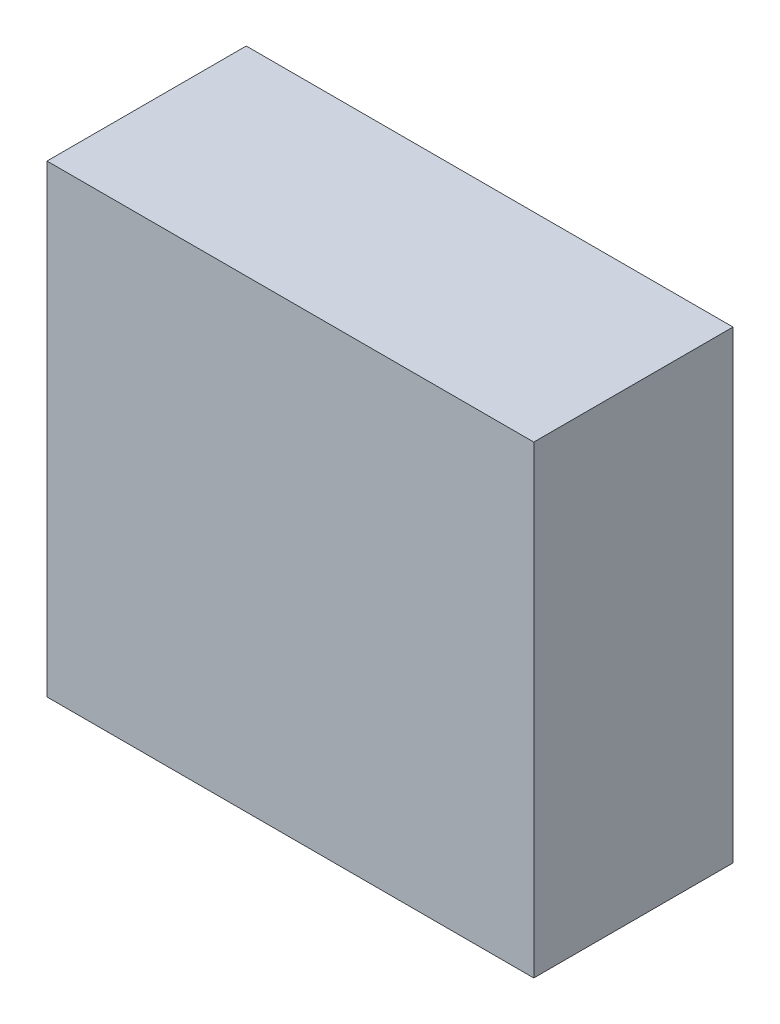
ISO-10303-21;
HEADER;
FILE_DESCRIPTION(('STEP AP214'),'2;1');
FILE_NAME('part.step','',(''),(''),'','','');
FILE_SCHEMA(('AUTOMOTIVE_DESIGN { 1 0 10303 214 1 1 1 1 }'));
ENDSEC;
DATA;
#1=APPLICATION_CONTEXT('core data for automotive mechanical design processes');
#2=APPLICATION_PROTOCOL_DEFINITION('international standard','automotive_design',2000,#1);
#3=PRODUCT_CONTEXT('',#1,'mechanical');
#4=PRODUCT('Part','Part','',(#3));
#5=PRODUCT_RELATED_PRODUCT_CATEGORY('part','',(#4));
#6=PRODUCT_DEFINITION_FORMATION('','',#4);
#7=PRODUCT_DEFINITION_CONTEXT('part definition',#1,'design');
#8=PRODUCT_DEFINITION('design','',#6,#7);
#9=PRODUCT_DEFINITION_SHAPE('','',#8);
#10=(LENGTH_UNIT() NAMED_UNIT(*) SI_UNIT(.MILLI.,.METRE.));
#11=(NAMED_UNIT(*) PLANE_ANGLE_UNIT() SI_UNIT($,.RADIAN.));
#12=(NAMED_UNIT(*) SI_UNIT($,.STERADIAN.) SOLID_ANGLE_UNIT());
#13=UNCERTAINTY_MEASURE_WITH_UNIT(LENGTH_MEASURE(1.E-05),#10,'distance_accuracy_value','');
#14=(GEOMETRIC_REPRESENTATION_CONTEXT(3) GLOBAL_UNCERTAINTY_ASSIGNED_CONTEXT((#13)) GLOBAL_UNIT_ASSIGNED_CONTEXT((#10,
#11,#12)) REPRESENTATION_CONTEXT('',''));
#15=CARTESIAN_POINT('',(0.,0.,0.));
#16=DIRECTION('',(0.,0.,1.));
#17=DIRECTION('',(1.,0.,0.));
#18=AXIS2_PLACEMENT_3D('',#15,#16,#17);
#19=CARTESIAN_POINT('',(21.5,-20.5,17.6));
#20=DIRECTION('',(-1.,0.,0.));
#21=DIRECTION('',(0.,0.,1.));
#22=AXIS2_PLACEMENT_3D('',#19,#20,#21);
#23=PLANE('',#22);
#24=DIRECTION('',(0.,1.,0.));
#25=VECTOR('',#24,1.);
#26=CARTESIAN_POINT('',(21.5,-20.5,0.));
#27=LINE('',#26,#25);
#28=CARTESIAN_POINT('',(21.5,-20.5,0.));
#29=VERTEX_POINT('',#28);
#30=CARTESIAN_POINT('',(21.5,20.5,0.));
#31=VERTEX_POINT('',#30);
#32=EDGE_CURVE('E112',#29,#31,#27,.T.);
#33=ORIENTED_EDGE('',*,*,#32,.T.);
#34=DIRECTION('',(0.,0.,-1.));
#35=VECTOR('',#34,1.);
#36=CARTESIAN_POINT('',(21.5,20.5,17.6));
#37=LINE('',#36,#35);
#38=CARTESIAN_POINT('',(21.5,20.5,17.6));
#39=VERTEX_POINT('',#38);
#40=EDGE_CURVE('E11',#39,#31,#37,.T.);
#41=ORIENTED_EDGE('',*,*,#40,.F.);
#42=DIRECTION('',(0.,1.,0.));
#43=VECTOR('',#42,1.);
#44=CARTESIAN_POINT('',(21.5,-20.5,17.6));
#45=LINE('',#44,#43);
#46=CARTESIAN_POINT('',(21.5,-20.5,17.6));
#47=VERTEX_POINT('',#46);
#48=EDGE_CURVE('E95',#47,#39,#45,.T.);
#49=ORIENTED_EDGE('',*,*,#48,.F.);
#50=DIRECTION('',(0.,0.,-1.));
#51=VECTOR('',#50,1.);
#52=CARTESIAN_POINT('',(21.5,-20.5,17.6));
#53=LINE('',#52,#51);
#54=EDGE_CURVE('E108',#47,#29,#53,.T.);
#55=ORIENTED_EDGE('',*,*,#54,.T.);
#56=EDGE_LOOP('',(#33,#41,#49,#55));
#57=FACE_BOUND('',#56,.T.);
#58=ADVANCED_FACE('F43',(#57),#23,.F.);
#59=CARTESIAN_POINT('',(-21.5,20.5,17.6));
#60=DIRECTION('',(0.,-1.,0.));
#61=DIRECTION('',(0.,0.,-1.));
#62=AXIS2_PLACEMENT_3D('',#59,#60,#61);
#63=PLANE('',#62);
#64=DIRECTION('',(-1.,0.,0.));
#65=VECTOR('',#64,1.);
#66=CARTESIAN_POINT('',(-21.5,20.5,0.));
#67=LINE('',#66,#65);
#68=CARTESIAN_POINT('',(-21.5,20.5,0.));
#69=VERTEX_POINT('',#68);
#70=EDGE_CURVE('E100',#31,#69,#67,.T.);
#71=ORIENTED_EDGE('',*,*,#70,.T.);
#72=DIRECTION('',(0.,0.,-1.));
#73=VECTOR('',#72,1.);
#74=CARTESIAN_POINT('',(-21.5,20.5,17.6));
#75=LINE('',#74,#73);
#76=CARTESIAN_POINT('',(-21.5,20.5,17.6));
#77=VERTEX_POINT('',#76);
#78=EDGE_CURVE('E52',#77,#69,#75,.T.);
#79=ORIENTED_EDGE('',*,*,#78,.F.);
#80=DIRECTION('',(-1.,0.,0.));
#81=VECTOR('',#80,1.);
#82=CARTESIAN_POINT('',(-21.5,20.5,17.6));
#83=LINE('',#82,#81);
#84=EDGE_CURVE('E90',#39,#77,#83,.T.);
#85=ORIENTED_EDGE('',*,*,#84,.F.);
#86=ORIENTED_EDGE('',*,*,#40,.T.);
#87=EDGE_LOOP('',(#71,#79,#85,#86));
#88=FACE_BOUND('',#87,.T.);
#89=ADVANCED_FACE('F99',(#88),#63,.F.);
#90=CARTESIAN_POINT('',(-21.5,-20.5,17.6));
#91=DIRECTION('',(1.,0.,0.));
#92=DIRECTION('',(0.,0.,-1.));
#93=AXIS2_PLACEMENT_3D('',#90,#91,#92);
#94=PLANE('',#93);
#95=DIRECTION('',(0.,-1.,0.));
#96=VECTOR('',#95,1.);
#97=CARTESIAN_POINT('',(-21.5,-20.5,0.));
#98=LINE('',#97,#96);
#99=CARTESIAN_POINT('',(-21.5,-20.5,0.));
#100=VERTEX_POINT('',#99);
#101=EDGE_CURVE('E77',#69,#100,#98,.T.);
#102=ORIENTED_EDGE('',*,*,#101,.T.);
#103=DIRECTION('',(0.,0.,-1.));
#104=VECTOR('',#103,1.);
#105=CARTESIAN_POINT('',(-21.5,-20.5,17.6));
#106=LINE('',#105,#104);
#107=CARTESIAN_POINT('',(-21.5,-20.5,17.6));
#108=VERTEX_POINT('',#107);
#109=EDGE_CURVE('E102',#108,#100,#106,.T.);
#110=ORIENTED_EDGE('',*,*,#109,.F.);
#111=DIRECTION('',(0.,-1.,0.));
#112=VECTOR('',#111,1.);
#113=CARTESIAN_POINT('',(-21.5,-20.5,17.6));
#114=LINE('',#113,#112);
#115=EDGE_CURVE('E93',#77,#108,#114,.T.);
#116=ORIENTED_EDGE('',*,*,#115,.F.);
#117=ORIENTED_EDGE('',*,*,#78,.T.);
#118=EDGE_LOOP('',(#102,#110,#116,#117));
#119=FACE_BOUND('',#118,.T.);
#120=ADVANCED_FACE('F103',(#119),#94,.F.);
#121=CARTESIAN_POINT('',(-21.5,-20.5,17.6));
#122=DIRECTION('',(0.,1.,0.));
#123=DIRECTION('',(0.,0.,1.));
#124=AXIS2_PLACEMENT_3D('',#121,#122,#123);
#125=PLANE('',#124);
#126=DIRECTION('',(1.,0.,0.));
#127=VECTOR('',#126,1.);
#128=CARTESIAN_POINT('',(-21.5,-20.5,0.));
#129=LINE('',#128,#127);
#130=EDGE_CURVE('E83',#100,#29,#129,.T.);
#131=ORIENTED_EDGE('',*,*,#130,.T.);
#132=ORIENTED_EDGE('',*,*,#54,.F.);
#133=DIRECTION('',(1.,0.,0.));
#134=VECTOR('',#133,1.);
#135=CARTESIAN_POINT('',(-21.5,-20.5,17.6));
#136=LINE('',#135,#134);
#137=EDGE_CURVE('E60',#108,#47,#136,.T.);
#138=ORIENTED_EDGE('',*,*,#137,.F.);
#139=ORIENTED_EDGE('',*,*,#109,.T.);
#140=EDGE_LOOP('',(#131,#132,#138,#139));
#141=FACE_BOUND('',#140,.T.);
#142=ADVANCED_FACE('F124',(#141),#125,.F.);
#143=CARTESIAN_POINT('',(0.,0.,17.6));
#144=DIRECTION('',(0.,0.,-1.));
#145=DIRECTION('',(-1.,0.,0.));
#146=AXIS2_PLACEMENT_3D('',#143,#144,#145);
#147=PLANE('',#146);
#148=ORIENTED_EDGE('',*,*,#48,.T.);
#149=ORIENTED_EDGE('',*,*,#84,.T.);
#150=ORIENTED_EDGE('',*,*,#115,.T.);
#151=ORIENTED_EDGE('',*,*,#137,.T.);
#152=EDGE_LOOP('',(#148,#149,#150,#151));
#153=FACE_BOUND('',#152,.T.);
#154=ADVANCED_FACE('F91',(#153),#147,.F.);
#155=CARTESIAN_POINT('',(0.,0.,0.));
#156=DIRECTION('',(0.,0.,-1.));
#157=DIRECTION('',(-1.,0.,0.));
#158=AXIS2_PLACEMENT_3D('',#155,#156,#157);
#159=PLANE('',#158);
#160=ORIENTED_EDGE('',*,*,#32,.F.);
#161=ORIENTED_EDGE('',*,*,#130,.F.);
#162=ORIENTED_EDGE('',*,*,#101,.F.);
#163=ORIENTED_EDGE('',*,*,#70,.F.);
#164=EDGE_LOOP('',(#160,#161,#162,#163));
#165=FACE_BOUND('',#164,.T.);
#166=ADVANCED_FACE('F127',(#165),#159,.T.);
#167=CLOSED_SHELL('',(#58,#89,#120,#142,#154,#166));
#168=MANIFOLD_SOLID_BREP('B2',#167);
#169=ADVANCED_BREP_SHAPE_REPRESENTATION('',(#18,#168),#14);
#170=SHAPE_DEFINITION_REPRESENTATION(#9,#169);
ENDSEC;
END-ISO-10303-21;
